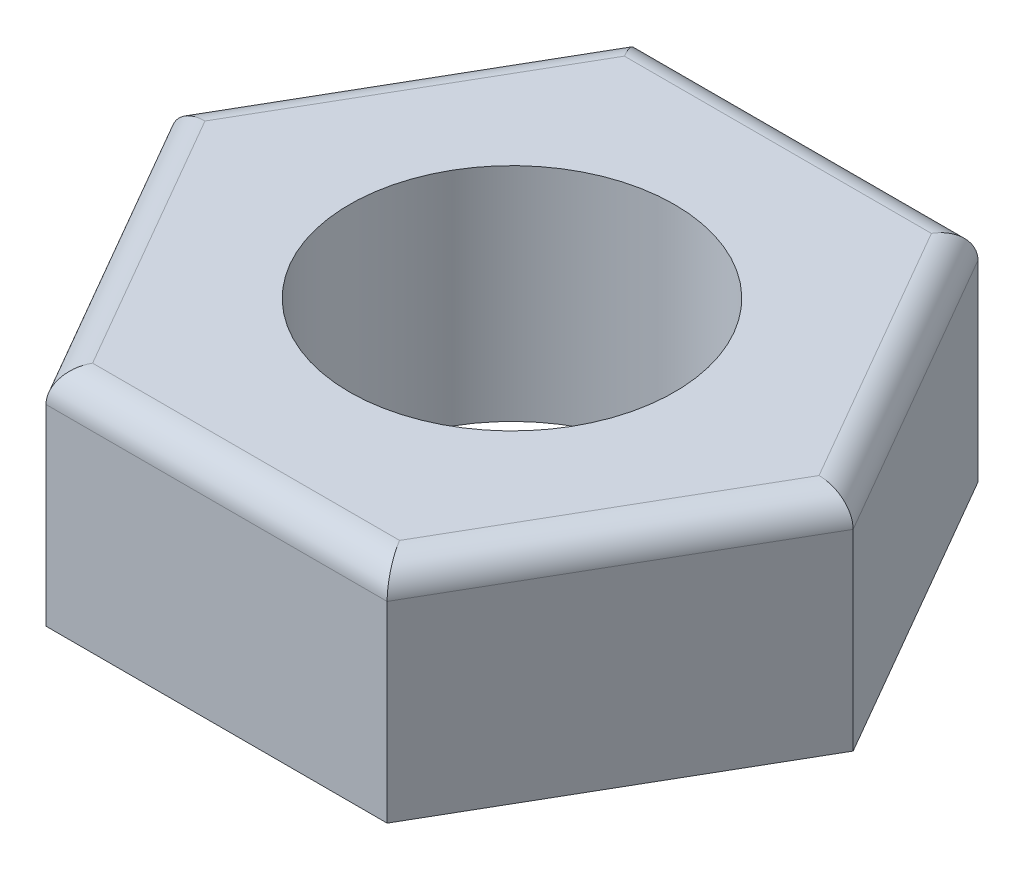
ISO-10303-21;
HEADER;
FILE_DESCRIPTION(('STEP AP214'),'2;1');
FILE_NAME('part.step','',(''),(''),'','','');
FILE_SCHEMA(('AUTOMOTIVE_DESIGN { 1 0 10303 214 1 1 1 1 }'));
ENDSEC;
DATA;
#1=APPLICATION_CONTEXT('core data for automotive mechanical design processes');
#2=APPLICATION_PROTOCOL_DEFINITION('international standard','automotive_design',2000,#1);
#3=PRODUCT_CONTEXT('',#1,'mechanical');
#4=PRODUCT('Part','Part','',(#3));
#5=PRODUCT_RELATED_PRODUCT_CATEGORY('part','',(#4));
#6=PRODUCT_DEFINITION_FORMATION('','',#4);
#7=PRODUCT_DEFINITION_CONTEXT('part definition',#1,'design');
#8=PRODUCT_DEFINITION('design','',#6,#7);
#9=PRODUCT_DEFINITION_SHAPE('','',#8);
#10=(LENGTH_UNIT() NAMED_UNIT(*) SI_UNIT(.MILLI.,.METRE.));
#11=(NAMED_UNIT(*) PLANE_ANGLE_UNIT() SI_UNIT($,.RADIAN.));
#12=(NAMED_UNIT(*) SI_UNIT($,.STERADIAN.) SOLID_ANGLE_UNIT());
#13=UNCERTAINTY_MEASURE_WITH_UNIT(LENGTH_MEASURE(1.E-05),#10,'distance_accuracy_value','');
#14=(GEOMETRIC_REPRESENTATION_CONTEXT(3) GLOBAL_UNCERTAINTY_ASSIGNED_CONTEXT((#13)) GLOBAL_UNIT_ASSIGNED_CONTEXT((#10,
#11,#12)) REPRESENTATION_CONTEXT('',''));
#15=CARTESIAN_POINT('',(0.,0.,0.));
#16=DIRECTION('',(0.,0.,1.));
#17=DIRECTION('',(1.,0.,0.));
#18=AXIS2_PLACEMENT_3D('',#15,#16,#17);
#19=CARTESIAN_POINT('',(-23.094010767585,15.,0.));
#20=DIRECTION('',(0.866025403784438,0.,-0.5));
#21=DIRECTION('',(-0.5,0.,-0.866025403784439));
#22=AXIS2_PLACEMENT_3D('',#19,#20,#21);
#23=PLANE('',#22);
#24=DIRECTION('',(0.,-1.,0.));
#25=VECTOR('',#24,1.);
#26=CARTESIAN_POINT('',(-11.5470053837925,15.,20.));
#27=LINE('',#26,#25);
#28=CARTESIAN_POINT('',(-11.5470053837925,13.,20.));
#29=VERTEX_POINT('',#28);
#30=CARTESIAN_POINT('',(-11.5470053837925,0.,20.));
#31=VERTEX_POINT('',#30);
#32=EDGE_CURVE('E109',#29,#31,#27,.T.);
#33=ORIENTED_EDGE('',*,*,#32,.F.);
#34=DIRECTION('',(0.5,0.,0.866025403784439));
#35=VECTOR('',#34,1.);
#36=CARTESIAN_POINT('',(-23.094010767585,13.,0.));
#37=LINE('',#36,#35);
#38=CARTESIAN_POINT('',(-23.094010767585,13.,0.));
#39=VERTEX_POINT('',#38);
#40=EDGE_CURVE('E171',#29,#39,#37,.F.);
#41=ORIENTED_EDGE('',*,*,#40,.T.);
#42=DIRECTION('',(0.,-1.,0.));
#43=VECTOR('',#42,1.);
#44=CARTESIAN_POINT('',(-23.094010767585,15.,0.));
#45=LINE('',#44,#43);
#46=CARTESIAN_POINT('',(-23.094010767585,0.,0.));
#47=VERTEX_POINT('',#46);
#48=EDGE_CURVE('E132',#39,#47,#45,.T.);
#49=ORIENTED_EDGE('',*,*,#48,.T.);
#50=DIRECTION('',(0.5,0.,0.866025403784438));
#51=VECTOR('',#50,1.);
#52=CARTESIAN_POINT('',(-23.094010767585,0.,0.));
#53=LINE('',#52,#51);
#54=EDGE_CURVE('E126',#47,#31,#53,.T.);
#55=ORIENTED_EDGE('',*,*,#54,.T.);
#56=EDGE_LOOP('',(#33,#41,#49,#55));
#57=FACE_BOUND('',#56,.T.);
#58=ADVANCED_FACE('F36',(#57),#23,.F.);
#59=CARTESIAN_POINT('',(-11.5470053837925,15.,20.));
#60=DIRECTION('',(0.,0.,-1.));
#61=DIRECTION('',(-1.,0.,0.));
#62=AXIS2_PLACEMENT_3D('',#59,#60,#61);
#63=PLANE('',#62);
#64=DIRECTION('',(0.,-1.,0.));
#65=VECTOR('',#64,1.);
#66=CARTESIAN_POINT('',(11.5470053837925,15.,20.));
#67=LINE('',#66,#65);
#68=CARTESIAN_POINT('',(11.5470053837925,13.,20.));
#69=VERTEX_POINT('',#68);
#70=CARTESIAN_POINT('',(11.5470053837925,0.,20.));
#71=VERTEX_POINT('',#70);
#72=EDGE_CURVE('E120',#69,#71,#67,.T.);
#73=ORIENTED_EDGE('',*,*,#72,.F.);
#74=DIRECTION('',(1.,0.,0.));
#75=VECTOR('',#74,1.);
#76=CARTESIAN_POINT('',(-11.5470053837925,13.,20.));
#77=LINE('',#76,#75);
#78=EDGE_CURVE('E116',#69,#29,#77,.F.);
#79=ORIENTED_EDGE('',*,*,#78,.T.);
#80=ORIENTED_EDGE('',*,*,#32,.T.);
#81=DIRECTION('',(1.,0.,0.));
#82=VECTOR('',#81,1.);
#83=CARTESIAN_POINT('',(-11.5470053837925,0.,20.));
#84=LINE('',#83,#82);
#85=EDGE_CURVE('E113',#31,#71,#84,.T.);
#86=ORIENTED_EDGE('',*,*,#85,.T.);
#87=EDGE_LOOP('',(#73,#79,#80,#86));
#88=FACE_BOUND('',#87,.T.);
#89=ADVANCED_FACE('F112',(#88),#63,.F.);
#90=CARTESIAN_POINT('',(11.5470053837925,15.,20.));
#91=DIRECTION('',(-0.866025403784439,0.,-0.5));
#92=DIRECTION('',(-0.5,0.,0.866025403784439));
#93=AXIS2_PLACEMENT_3D('',#90,#91,#92);
#94=PLANE('',#93);
#95=DIRECTION('',(0.,-1.,0.));
#96=VECTOR('',#95,1.);
#97=CARTESIAN_POINT('',(23.094010767585,15.,0.));
#98=LINE('',#97,#96);
#99=CARTESIAN_POINT('',(23.094010767585,13.,0.));
#100=VERTEX_POINT('',#99);
#101=CARTESIAN_POINT('',(23.094010767585,0.,0.));
#102=VERTEX_POINT('',#101);
#103=EDGE_CURVE('E155',#100,#102,#98,.T.);
#104=ORIENTED_EDGE('',*,*,#103,.F.);
#105=DIRECTION('',(0.5,0.,-0.866025403784439));
#106=VECTOR('',#105,1.);
#107=CARTESIAN_POINT('',(11.5470053837925,13.,20.));
#108=LINE('',#107,#106);
#109=EDGE_CURVE('E11',#100,#69,#108,.F.);
#110=ORIENTED_EDGE('',*,*,#109,.T.);
#111=ORIENTED_EDGE('',*,*,#72,.T.);
#112=DIRECTION('',(0.5,0.,-0.866025403784439));
#113=VECTOR('',#112,1.);
#114=CARTESIAN_POINT('',(11.5470053837925,0.,20.));
#115=LINE('',#114,#113);
#116=EDGE_CURVE('E129',#71,#102,#115,.T.);
#117=ORIENTED_EDGE('',*,*,#116,.T.);
#118=EDGE_LOOP('',(#104,#110,#111,#117));
#119=FACE_BOUND('',#118,.T.);
#120=ADVANCED_FACE('F221',(#119),#94,.F.);
#121=CARTESIAN_POINT('',(23.094010767585,15.,0.));
#122=DIRECTION('',(-0.866025403784438,0.,0.5));
#123=DIRECTION('',(0.5,0.,0.866025403784438));
#124=AXIS2_PLACEMENT_3D('',#121,#122,#123);
#125=PLANE('',#124);
#126=DIRECTION('',(0.,-1.,0.));
#127=VECTOR('',#126,1.);
#128=CARTESIAN_POINT('',(11.5470053837925,15.,-20.));
#129=LINE('',#128,#127);
#130=CARTESIAN_POINT('',(11.5470053837925,13.,-20.));
#131=VERTEX_POINT('',#130);
#132=CARTESIAN_POINT('',(11.5470053837925,0.,-20.));
#133=VERTEX_POINT('',#132);
#134=EDGE_CURVE('E153',#131,#133,#129,.T.);
#135=ORIENTED_EDGE('',*,*,#134,.F.);
#136=DIRECTION('',(-0.5,0.,-0.866025403784438));
#137=VECTOR('',#136,1.);
#138=CARTESIAN_POINT('',(23.094010767585,13.,0.));
#139=LINE('',#138,#137);
#140=EDGE_CURVE('E45',#131,#100,#139,.F.);
#141=ORIENTED_EDGE('',*,*,#140,.T.);
#142=ORIENTED_EDGE('',*,*,#103,.T.);
#143=DIRECTION('',(-0.5,0.,-0.866025403784438));
#144=VECTOR('',#143,1.);
#145=CARTESIAN_POINT('',(23.094010767585,0.,0.));
#146=LINE('',#145,#144);
#147=EDGE_CURVE('E142',#102,#133,#146,.T.);
#148=ORIENTED_EDGE('',*,*,#147,.T.);
#149=EDGE_LOOP('',(#135,#141,#142,#148));
#150=FACE_BOUND('',#149,.T.);
#151=ADVANCED_FACE('F261',(#150),#125,.F.);
#152=CARTESIAN_POINT('',(11.5470053837925,15.,-20.));
#153=DIRECTION('',(0.,0.,1.));
#154=DIRECTION('',(1.,0.,0.));
#155=AXIS2_PLACEMENT_3D('',#152,#153,#154);
#156=PLANE('',#155);
#157=DIRECTION('',(0.,-1.,0.));
#158=VECTOR('',#157,1.);
#159=CARTESIAN_POINT('',(-11.5470053837925,15.,-20.));
#160=LINE('',#159,#158);
#161=CARTESIAN_POINT('',(-11.5470053837925,13.,-20.));
#162=VERTEX_POINT('',#161);
#163=CARTESIAN_POINT('',(-11.5470053837925,0.,-20.));
#164=VERTEX_POINT('',#163);
#165=EDGE_CURVE('E151',#162,#164,#160,.T.);
#166=ORIENTED_EDGE('',*,*,#165,.F.);
#167=DIRECTION('',(-1.,0.,0.));
#168=VECTOR('',#167,1.);
#169=CARTESIAN_POINT('',(11.5470053837925,13.,-20.));
#170=LINE('',#169,#168);
#171=EDGE_CURVE('E60',#162,#131,#170,.F.);
#172=ORIENTED_EDGE('',*,*,#171,.T.);
#173=ORIENTED_EDGE('',*,*,#134,.T.);
#174=DIRECTION('',(-1.,0.,0.));
#175=VECTOR('',#174,1.);
#176=CARTESIAN_POINT('',(11.5470053837925,0.,-20.));
#177=LINE('',#176,#175);
#178=EDGE_CURVE('E145',#133,#164,#177,.T.);
#179=ORIENTED_EDGE('',*,*,#178,.T.);
#180=EDGE_LOOP('',(#166,#172,#173,#179));
#181=FACE_BOUND('',#180,.T.);
#182=ADVANCED_FACE('F212',(#181),#156,.F.);
#183=CARTESIAN_POINT('',(-11.5470053837925,15.,-20.));
#184=DIRECTION('',(0.866025403784439,0.,0.5));
#185=DIRECTION('',(0.5,0.,-0.866025403784439));
#186=AXIS2_PLACEMENT_3D('',#183,#184,#185);
#187=PLANE('',#186);
#188=ORIENTED_EDGE('',*,*,#48,.F.);
#189=DIRECTION('',(-0.5,0.,0.866025403784439));
#190=VECTOR('',#189,1.);
#191=CARTESIAN_POINT('',(-11.5470053837925,13.,-20.));
#192=LINE('',#191,#190);
#193=EDGE_CURVE('E173',#39,#162,#192,.F.);
#194=ORIENTED_EDGE('',*,*,#193,.T.);
#195=ORIENTED_EDGE('',*,*,#165,.T.);
#196=DIRECTION('',(-0.5,0.,0.866025403784439));
#197=VECTOR('',#196,1.);
#198=CARTESIAN_POINT('',(-11.5470053837925,0.,-20.));
#199=LINE('',#198,#197);
#200=EDGE_CURVE('E148',#164,#47,#199,.T.);
#201=ORIENTED_EDGE('',*,*,#200,.T.);
#202=EDGE_LOOP('',(#188,#194,#195,#201));
#203=FACE_BOUND('',#202,.T.);
#204=ADVANCED_FACE('F203',(#203),#187,.F.);
#205=CARTESIAN_POINT('',(-11.5470053837925,15.,20.));
#206=DIRECTION('',(0.,1.,0.));
#207=DIRECTION('',(0.,0.,1.));
#208=AXIS2_PLACEMENT_3D('',#205,#206,#207);
#209=PLANE('',#208);
#210=DIRECTION('',(0.5,0.,0.866025403784439));
#211=VECTOR('',#210,1.);
#212=CARTESIAN_POINT('',(-9.81495457622363,15.,19.));
#213=LINE('',#212,#211);
#214=CARTESIAN_POINT('',(-20.7846096908265,15.,0.));
#215=VERTEX_POINT('',#214);
#216=CARTESIAN_POINT('',(-10.3923048454133,15.,18.));
#217=VERTEX_POINT('',#216);
#218=EDGE_CURVE('E165',#215,#217,#213,.T.);
#219=ORIENTED_EDGE('',*,*,#218,.T.);
#220=DIRECTION('',(1.,0.,0.));
#221=VECTOR('',#220,1.);
#222=CARTESIAN_POINT('',(11.5470053837925,15.,18.));
#223=LINE('',#222,#221);
#224=CARTESIAN_POINT('',(10.3923048454133,15.,18.));
#225=VERTEX_POINT('',#224);
#226=EDGE_CURVE('E167',#217,#225,#223,.T.);
#227=ORIENTED_EDGE('',*,*,#226,.T.);
#228=DIRECTION('',(0.5,0.,-0.866025403784439));
#229=VECTOR('',#228,1.);
#230=CARTESIAN_POINT('',(21.3619599600162,15.,-1.00000000000001));
#231=LINE('',#230,#229);
#232=CARTESIAN_POINT('',(20.7846096908265,15.,0.));
#233=VERTEX_POINT('',#232);
#234=EDGE_CURVE('E119',#225,#233,#231,.T.);
#235=ORIENTED_EDGE('',*,*,#234,.T.);
#236=DIRECTION('',(-0.5,0.,-0.866025403784438));
#237=VECTOR('',#236,1.);
#238=CARTESIAN_POINT('',(9.81495457622363,15.,-19.));
#239=LINE('',#238,#237);
#240=CARTESIAN_POINT('',(10.3923048454133,15.,-18.));
#241=VERTEX_POINT('',#240);
#242=EDGE_CURVE('E159',#233,#241,#239,.T.);
#243=ORIENTED_EDGE('',*,*,#242,.T.);
#244=DIRECTION('',(-1.,0.,0.));
#245=VECTOR('',#244,1.);
#246=CARTESIAN_POINT('',(-11.5470053837925,15.,-18.));
#247=LINE('',#246,#245);
#248=CARTESIAN_POINT('',(-10.3923048454133,15.,-18.));
#249=VERTEX_POINT('',#248);
#250=EDGE_CURVE('E161',#241,#249,#247,.T.);
#251=ORIENTED_EDGE('',*,*,#250,.T.);
#252=DIRECTION('',(-0.5,0.,0.866025403784439));
#253=VECTOR('',#252,1.);
#254=CARTESIAN_POINT('',(-21.3619599600162,15.,0.999999999999994));
#255=LINE('',#254,#253);
#256=EDGE_CURVE('E163',#249,#215,#255,.T.);
#257=ORIENTED_EDGE('',*,*,#256,.T.);
#258=EDGE_LOOP('',(#219,#227,#235,#243,#251,#257));
#259=FACE_BOUND('',#258,.T.);
#260=CARTESIAN_POINT('',(0.,15.,0.));
#261=DIRECTION('',(0.,1.,0.));
#262=DIRECTION('',(0.,0.,1.));
#263=AXIS2_PLACEMENT_3D('',#260,#261,#262);
#264=CIRCLE('',#263,11.);
#265=CARTESIAN_POINT('',(0.,15.,11.));
#266=VERTEX_POINT('',#265);
#267=EDGE_CURVE('E137',#266,#266,#264,.T.);
#268=ORIENTED_EDGE('',*,*,#267,.F.);
#269=EDGE_LOOP('',(#268));
#270=FACE_BOUND('',#269,.T.);
#271=ADVANCED_FACE('F201',(#259,#270),#209,.T.);
#272=CARTESIAN_POINT('',(-11.5470053837925,0.,20.));
#273=DIRECTION('',(0.,1.,0.));
#274=DIRECTION('',(0.,0.,1.));
#275=AXIS2_PLACEMENT_3D('',#272,#273,#274);
#276=PLANE('',#275);
#277=CARTESIAN_POINT('',(0.,0.,0.));
#278=DIRECTION('',(0.,1.,0.));
#279=DIRECTION('',(0.,0.,1.));
#280=AXIS2_PLACEMENT_3D('',#277,#278,#279);
#281=CIRCLE('',#280,11.);
#282=CARTESIAN_POINT('',(0.,0.,11.));
#283=VERTEX_POINT('',#282);
#284=EDGE_CURVE('E134',#283,#283,#281,.T.);
#285=ORIENTED_EDGE('',*,*,#284,.T.);
#286=EDGE_LOOP('',(#285));
#287=FACE_BOUND('',#286,.T.);
#288=ORIENTED_EDGE('',*,*,#54,.F.);
#289=ORIENTED_EDGE('',*,*,#200,.F.);
#290=ORIENTED_EDGE('',*,*,#178,.F.);
#291=ORIENTED_EDGE('',*,*,#147,.F.);
#292=ORIENTED_EDGE('',*,*,#116,.F.);
#293=ORIENTED_EDGE('',*,*,#85,.F.);
#294=EDGE_LOOP('',(#288,#289,#290,#291,#292,#293));
#295=FACE_BOUND('',#294,.T.);
#296=ADVANCED_FACE('F124',(#287,#295),#276,.F.);
#297=CARTESIAN_POINT('',(0.,0.,0.));
#298=DIRECTION('',(0.,1.,0.));
#299=DIRECTION('',(0.,0.,1.));
#300=AXIS2_PLACEMENT_3D('',#297,#298,#299);
#301=CYLINDRICAL_SURFACE('',#300,11.);
#302=ORIENTED_EDGE('',*,*,#284,.F.);
#303=EDGE_LOOP('',(#302));
#304=FACE_BOUND('',#303,.T.);
#305=ORIENTED_EDGE('',*,*,#267,.T.);
#306=EDGE_LOOP('',(#305));
#307=FACE_BOUND('',#306,.T.);
#308=ADVANCED_FACE('F199',(#304,#307),#301,.F.);
#309=CARTESIAN_POINT('',(-11.5470053837925,13.,-18.));
#310=DIRECTION('',(1.,0.,0.));
#311=DIRECTION('',(0.,0.,-1.));
#312=AXIS2_PLACEMENT_3D('',#309,#310,#311);
#313=CYLINDRICAL_SURFACE('',#312,2.);
#314=CARTESIAN_POINT('',(10.3923048454132,13.,-18.));
#315=DIRECTION('',(0.866025403784439,0.,0.5));
#316=DIRECTION('',(-0.5,0.,0.866025403784439));
#317=AXIS2_PLACEMENT_3D('',#314,#315,#316);
#318=ELLIPSE('',#317,2.3094010767585,2.);
#319=EDGE_CURVE('E186',#131,#241,#318,.T.);
#320=ORIENTED_EDGE('',*,*,#319,.F.);
#321=ORIENTED_EDGE('',*,*,#171,.F.);
#322=CARTESIAN_POINT('',(-10.3923048454133,13.,-18.));
#323=DIRECTION('',(0.866025403784439,0.,-0.5));
#324=DIRECTION('',(0.5,0.,0.866025403784439));
#325=AXIS2_PLACEMENT_3D('',#322,#323,#324);
#326=ELLIPSE('',#325,2.3094010767585,2.);
#327=EDGE_CURVE('E40',#249,#162,#326,.F.);
#328=ORIENTED_EDGE('',*,*,#327,.F.);
#329=ORIENTED_EDGE('',*,*,#250,.F.);
#330=EDGE_LOOP('',(#320,#321,#328,#329));
#331=FACE_BOUND('',#330,.T.);
#332=ADVANCED_FACE('F38',(#331),#313,.T.);
#333=CARTESIAN_POINT('',(-27.1354626519124,13.,11.));
#334=DIRECTION('',(0.5,0.,-0.866025403784439));
#335=DIRECTION('',(-0.866025403784439,0.,-0.5));
#336=AXIS2_PLACEMENT_3D('',#333,#334,#335);
#337=CYLINDRICAL_SURFACE('',#336,2.);
#338=ORIENTED_EDGE('',*,*,#327,.T.);
#339=ORIENTED_EDGE('',*,*,#193,.F.);
#340=CARTESIAN_POINT('',(-20.7846096908265,13.,0.));
#341=DIRECTION('',(0.,0.,-1.));
#342=DIRECTION('',(1.,0.,0.));
#343=AXIS2_PLACEMENT_3D('',#340,#341,#342);
#344=ELLIPSE('',#343,2.3094010767585,2.);
#345=EDGE_CURVE('E184',#215,#39,#344,.F.);
#346=ORIENTED_EDGE('',*,*,#345,.F.);
#347=ORIENTED_EDGE('',*,*,#256,.F.);
#348=EDGE_LOOP('',(#338,#339,#346,#347));
#349=FACE_BOUND('',#348,.T.);
#350=ADVANCED_FACE('F239',(#349),#337,.T.);
#351=CARTESIAN_POINT('',(21.3619599600161,13.,0.999999999999984));
#352=DIRECTION('',(0.5,0.,0.866025403784438));
#353=DIRECTION('',(0.866025403784438,0.,-0.5));
#354=AXIS2_PLACEMENT_3D('',#351,#352,#353);
#355=CYLINDRICAL_SURFACE('',#354,2.);
#356=ORIENTED_EDGE('',*,*,#319,.T.);
#357=ORIENTED_EDGE('',*,*,#242,.F.);
#358=CARTESIAN_POINT('',(20.7846096908265,13.,0.));
#359=DIRECTION('',(0.,0.,1.));
#360=DIRECTION('',(-1.,0.,0.));
#361=AXIS2_PLACEMENT_3D('',#358,#359,#360);
#362=ELLIPSE('',#361,2.3094010767585,2.);
#363=EDGE_CURVE('E181',#100,#233,#362,.T.);
#364=ORIENTED_EDGE('',*,*,#363,.F.);
#365=ORIENTED_EDGE('',*,*,#140,.F.);
#366=EDGE_LOOP('',(#356,#357,#364,#365));
#367=FACE_BOUND('',#366,.T.);
#368=ADVANCED_FACE('F236',(#367),#355,.T.);
#369=CARTESIAN_POINT('',(-9.81495457622363,13.,19.));
#370=DIRECTION('',(-0.5,0.,-0.866025403784439));
#371=DIRECTION('',(-0.866025403784438,0.,0.5));
#372=AXIS2_PLACEMENT_3D('',#369,#370,#371);
#373=CYLINDRICAL_SURFACE('',#372,2.);
#374=ORIENTED_EDGE('',*,*,#345,.T.);
#375=ORIENTED_EDGE('',*,*,#40,.F.);
#376=CARTESIAN_POINT('',(-10.3923048454133,13.,18.));
#377=DIRECTION('',(-0.866025403784439,0.,-0.5));
#378=DIRECTION('',(0.5,0.,-0.866025403784439));
#379=AXIS2_PLACEMENT_3D('',#376,#377,#378);
#380=ELLIPSE('',#379,2.3094010767585,2.);
#381=EDGE_CURVE('E179',#217,#29,#380,.F.);
#382=ORIENTED_EDGE('',*,*,#381,.F.);
#383=ORIENTED_EDGE('',*,*,#218,.F.);
#384=EDGE_LOOP('',(#374,#375,#382,#383));
#385=FACE_BOUND('',#384,.T.);
#386=ADVANCED_FACE('F232',(#385),#373,.T.);
#387=CARTESIAN_POINT('',(4.04145188432738,13.,29.));
#388=DIRECTION('',(-0.5,0.,0.866025403784439));
#389=DIRECTION('',(0.866025403784439,0.,0.5));
#390=AXIS2_PLACEMENT_3D('',#387,#388,#389);
#391=CYLINDRICAL_SURFACE('',#390,2.);
#392=ORIENTED_EDGE('',*,*,#363,.T.);
#393=ORIENTED_EDGE('',*,*,#234,.F.);
#394=CARTESIAN_POINT('',(10.3923048454133,13.,18.));
#395=DIRECTION('',(-0.866025403784438,0.,0.5));
#396=DIRECTION('',(0.5,0.,0.866025403784439));
#397=AXIS2_PLACEMENT_3D('',#394,#395,#396);
#398=ELLIPSE('',#397,2.3094010767585,2.);
#399=EDGE_CURVE('E177',#69,#225,#398,.T.);
#400=ORIENTED_EDGE('',*,*,#399,.F.);
#401=ORIENTED_EDGE('',*,*,#109,.F.);
#402=EDGE_LOOP('',(#392,#393,#400,#401));
#403=FACE_BOUND('',#402,.T.);
#404=ADVANCED_FACE('F228',(#403),#391,.T.);
#405=CARTESIAN_POINT('',(-11.5470053837925,13.,18.));
#406=DIRECTION('',(-1.,0.,0.));
#407=DIRECTION('',(0.,0.,1.));
#408=AXIS2_PLACEMENT_3D('',#405,#406,#407);
#409=CYLINDRICAL_SURFACE('',#408,2.);
#410=ORIENTED_EDGE('',*,*,#381,.T.);
#411=ORIENTED_EDGE('',*,*,#78,.F.);
#412=ORIENTED_EDGE('',*,*,#399,.T.);
#413=ORIENTED_EDGE('',*,*,#226,.F.);
#414=EDGE_LOOP('',(#410,#411,#412,#413));
#415=FACE_BOUND('',#414,.T.);
#416=ADVANCED_FACE('F225',(#415),#409,.T.);
#417=CLOSED_SHELL('',(#58,#89,#120,#151,#182,#204,#271,#296,#308,#332,#350,#368,#386,#404,#416));
#418=MANIFOLD_SOLID_BREP('B2',#417);
#419=ADVANCED_BREP_SHAPE_REPRESENTATION('',(#18,#418),#14);
#420=SHAPE_DEFINITION_REPRESENTATION(#9,#419);
ENDSEC;
END-ISO-10303-21;
